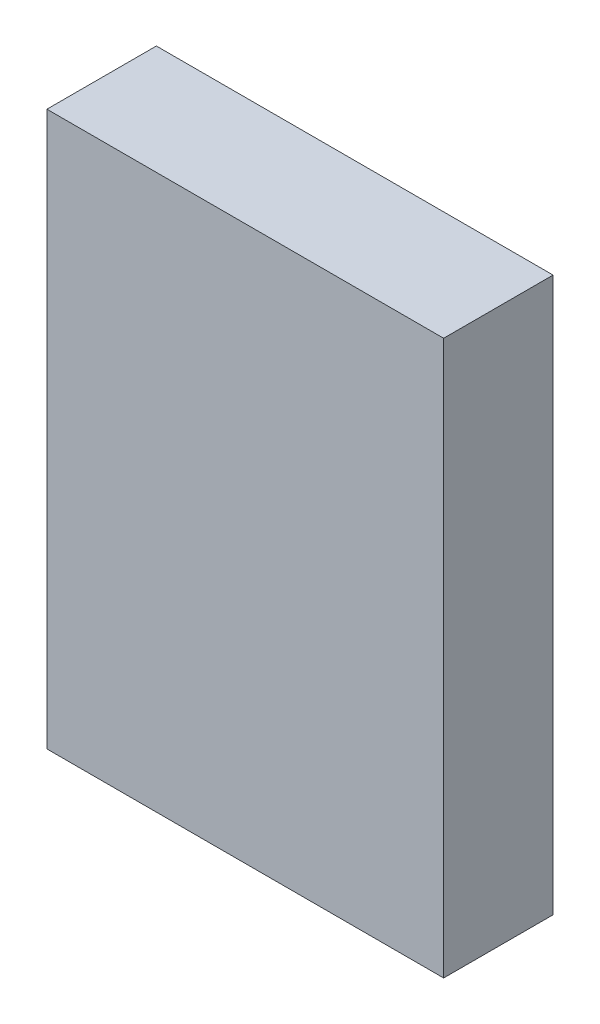
ISO-10303-21;
HEADER;
FILE_DESCRIPTION(('STEP AP214'),'2;1');
FILE_NAME('part.step','',(''),(''),'','','');
FILE_SCHEMA(('AUTOMOTIVE_DESIGN { 1 0 10303 214 1 1 1 1 }'));
ENDSEC;
DATA;
#1=APPLICATION_CONTEXT('core data for automotive mechanical design processes');
#2=APPLICATION_PROTOCOL_DEFINITION('international standard','automotive_design',2000,#1);
#3=PRODUCT_CONTEXT('',#1,'mechanical');
#4=PRODUCT('Part','Part','',(#3));
#5=PRODUCT_RELATED_PRODUCT_CATEGORY('part','',(#4));
#6=PRODUCT_DEFINITION_FORMATION('','',#4);
#7=PRODUCT_DEFINITION_CONTEXT('part definition',#1,'design');
#8=PRODUCT_DEFINITION('design','',#6,#7);
#9=PRODUCT_DEFINITION_SHAPE('','',#8);
#10=(LENGTH_UNIT() NAMED_UNIT(*) SI_UNIT(.MILLI.,.METRE.));
#11=(NAMED_UNIT(*) PLANE_ANGLE_UNIT() SI_UNIT($,.RADIAN.));
#12=(NAMED_UNIT(*) SI_UNIT($,.STERADIAN.) SOLID_ANGLE_UNIT());
#13=UNCERTAINTY_MEASURE_WITH_UNIT(LENGTH_MEASURE(1.E-05),#10,'distance_accuracy_value','');
#14=(GEOMETRIC_REPRESENTATION_CONTEXT(3) GLOBAL_UNCERTAINTY_ASSIGNED_CONTEXT((#13)) GLOBAL_UNIT_ASSIGNED_CONTEXT((#10,
#11,#12)) REPRESENTATION_CONTEXT('',''));
#15=CARTESIAN_POINT('',(0.,0.,0.));
#16=DIRECTION('',(0.,0.,1.));
#17=DIRECTION('',(1.,0.,0.));
#18=AXIS2_PLACEMENT_3D('',#15,#16,#17);
#19=CARTESIAN_POINT('',(0.,0.,50.8));
#20=DIRECTION('',(1.,0.,0.));
#21=DIRECTION('',(0.,0.,-1.));
#22=AXIS2_PLACEMENT_3D('',#19,#20,#21);
#23=PLANE('',#22);
#24=DIRECTION('',(0.,-1.,0.));
#25=VECTOR('',#24,1.);
#26=CARTESIAN_POINT('',(0.,0.,0.));
#27=LINE('',#26,#25);
#28=CARTESIAN_POINT('',(0.,257.175,0.));
#29=VERTEX_POINT('',#28);
#30=CARTESIAN_POINT('',(0.,0.,0.));
#31=VERTEX_POINT('',#30);
#32=EDGE_CURVE('E98',#29,#31,#27,.T.);
#33=ORIENTED_EDGE('',*,*,#32,.T.);
#34=DIRECTION('',(0.,0.,-1.));
#35=VECTOR('',#34,1.);
#36=CARTESIAN_POINT('',(0.,0.,50.8));
#37=LINE('',#36,#35);
#38=CARTESIAN_POINT('',(0.,0.,50.8));
#39=VERTEX_POINT('',#38);
#40=EDGE_CURVE('E11',#39,#31,#37,.T.);
#41=ORIENTED_EDGE('',*,*,#40,.F.);
#42=DIRECTION('',(0.,-1.,0.));
#43=VECTOR('',#42,1.);
#44=CARTESIAN_POINT('',(0.,0.,50.8));
#45=LINE('',#44,#43);
#46=CARTESIAN_POINT('',(0.,257.175,50.8));
#47=VERTEX_POINT('',#46);
#48=EDGE_CURVE('E86',#47,#39,#45,.T.);
#49=ORIENTED_EDGE('',*,*,#48,.F.);
#50=DIRECTION('',(0.,0.,-1.));
#51=VECTOR('',#50,1.);
#52=CARTESIAN_POINT('',(0.,257.175,50.8));
#53=LINE('',#52,#51);
#54=EDGE_CURVE('E94',#47,#29,#53,.T.);
#55=ORIENTED_EDGE('',*,*,#54,.T.);
#56=EDGE_LOOP('',(#33,#41,#49,#55));
#57=FACE_BOUND('',#56,.T.);
#58=ADVANCED_FACE('F35',(#57),#23,.F.);
#59=CARTESIAN_POINT('',(0.,0.,50.8));
#60=DIRECTION('',(0.,1.,0.));
#61=DIRECTION('',(0.,0.,1.));
#62=AXIS2_PLACEMENT_3D('',#59,#60,#61);
#63=PLANE('',#62);
#64=DIRECTION('',(1.,0.,0.));
#65=VECTOR('',#64,1.);
#66=CARTESIAN_POINT('',(0.,0.,0.));
#67=LINE('',#66,#65);
#68=CARTESIAN_POINT('',(184.15,0.,0.));
#69=VERTEX_POINT('',#68);
#70=EDGE_CURVE('E90',#31,#69,#67,.T.);
#71=ORIENTED_EDGE('',*,*,#70,.T.);
#72=DIRECTION('',(0.,0.,-1.));
#73=VECTOR('',#72,1.);
#74=CARTESIAN_POINT('',(184.15,0.,50.8));
#75=LINE('',#74,#73);
#76=CARTESIAN_POINT('',(184.15,0.,50.8));
#77=VERTEX_POINT('',#76);
#78=EDGE_CURVE('E43',#77,#69,#75,.T.);
#79=ORIENTED_EDGE('',*,*,#78,.F.);
#80=DIRECTION('',(1.,0.,0.));
#81=VECTOR('',#80,1.);
#82=CARTESIAN_POINT('',(0.,0.,50.8));
#83=LINE('',#82,#81);
#84=EDGE_CURVE('E81',#39,#77,#83,.T.);
#85=ORIENTED_EDGE('',*,*,#84,.F.);
#86=ORIENTED_EDGE('',*,*,#40,.T.);
#87=EDGE_LOOP('',(#71,#79,#85,#86));
#88=FACE_BOUND('',#87,.T.);
#89=ADVANCED_FACE('F89',(#88),#63,.F.);
#90=CARTESIAN_POINT('',(184.15,0.,50.8));
#91=DIRECTION('',(-1.,0.,0.));
#92=DIRECTION('',(0.,0.,1.));
#93=AXIS2_PLACEMENT_3D('',#90,#91,#92);
#94=PLANE('',#93);
#95=DIRECTION('',(0.,1.,0.));
#96=VECTOR('',#95,1.);
#97=CARTESIAN_POINT('',(184.15,0.,0.));
#98=LINE('',#97,#96);
#99=CARTESIAN_POINT('',(184.15,257.175,0.));
#100=VERTEX_POINT('',#99);
#101=EDGE_CURVE('E68',#69,#100,#98,.T.);
#102=ORIENTED_EDGE('',*,*,#101,.T.);
#103=DIRECTION('',(0.,0.,-1.));
#104=VECTOR('',#103,1.);
#105=CARTESIAN_POINT('',(184.15,257.175,50.8));
#106=LINE('',#105,#104);
#107=CARTESIAN_POINT('',(184.15,257.175,50.8));
#108=VERTEX_POINT('',#107);
#109=EDGE_CURVE('E91',#108,#100,#106,.T.);
#110=ORIENTED_EDGE('',*,*,#109,.F.);
#111=DIRECTION('',(0.,1.,0.));
#112=VECTOR('',#111,1.);
#113=CARTESIAN_POINT('',(184.15,0.,50.8));
#114=LINE('',#113,#112);
#115=EDGE_CURVE('E84',#77,#108,#114,.T.);
#116=ORIENTED_EDGE('',*,*,#115,.F.);
#117=ORIENTED_EDGE('',*,*,#78,.T.);
#118=EDGE_LOOP('',(#102,#110,#116,#117));
#119=FACE_BOUND('',#118,.T.);
#120=ADVANCED_FACE('F92',(#119),#94,.F.);
#121=CARTESIAN_POINT('',(0.,257.175,50.8));
#122=DIRECTION('',(0.,-1.,0.));
#123=DIRECTION('',(0.,0.,-1.));
#124=AXIS2_PLACEMENT_3D('',#121,#122,#123);
#125=PLANE('',#124);
#126=DIRECTION('',(-1.,0.,0.));
#127=VECTOR('',#126,1.);
#128=CARTESIAN_POINT('',(0.,257.175,0.));
#129=LINE('',#128,#127);
#130=EDGE_CURVE('E74',#100,#29,#129,.T.);
#131=ORIENTED_EDGE('',*,*,#130,.T.);
#132=ORIENTED_EDGE('',*,*,#54,.F.);
#133=DIRECTION('',(-1.,0.,0.));
#134=VECTOR('',#133,1.);
#135=CARTESIAN_POINT('',(0.,257.175,50.8));
#136=LINE('',#135,#134);
#137=EDGE_CURVE('E51',#108,#47,#136,.T.);
#138=ORIENTED_EDGE('',*,*,#137,.F.);
#139=ORIENTED_EDGE('',*,*,#109,.T.);
#140=EDGE_LOOP('',(#131,#132,#138,#139));
#141=FACE_BOUND('',#140,.T.);
#142=ADVANCED_FACE('F105',(#141),#125,.F.);
#143=CARTESIAN_POINT('',(0.,0.,50.8));
#144=DIRECTION('',(0.,0.,-1.));
#145=DIRECTION('',(-1.,0.,0.));
#146=AXIS2_PLACEMENT_3D('',#143,#144,#145);
#147=PLANE('',#146);
#148=ORIENTED_EDGE('',*,*,#48,.T.);
#149=ORIENTED_EDGE('',*,*,#84,.T.);
#150=ORIENTED_EDGE('',*,*,#115,.T.);
#151=ORIENTED_EDGE('',*,*,#137,.T.);
#152=EDGE_LOOP('',(#148,#149,#150,#151));
#153=FACE_BOUND('',#152,.T.);
#154=ADVANCED_FACE('F82',(#153),#147,.F.);
#155=CARTESIAN_POINT('',(0.,0.,0.));
#156=DIRECTION('',(0.,0.,-1.));
#157=DIRECTION('',(-1.,0.,0.));
#158=AXIS2_PLACEMENT_3D('',#155,#156,#157);
#159=PLANE('',#158);
#160=ORIENTED_EDGE('',*,*,#32,.F.);
#161=ORIENTED_EDGE('',*,*,#130,.F.);
#162=ORIENTED_EDGE('',*,*,#101,.F.);
#163=ORIENTED_EDGE('',*,*,#70,.F.);
#164=EDGE_LOOP('',(#160,#161,#162,#163));
#165=FACE_BOUND('',#164,.T.);
#166=ADVANCED_FACE('F108',(#165),#159,.T.);
#167=CLOSED_SHELL('',(#58,#89,#120,#142,#154,#166));
#168=MANIFOLD_SOLID_BREP('B2',#167);
#169=ADVANCED_BREP_SHAPE_REPRESENTATION('',(#18,#168),#14);
#170=SHAPE_DEFINITION_REPRESENTATION(#9,#169);
ENDSEC;
END-ISO-10303-21;
